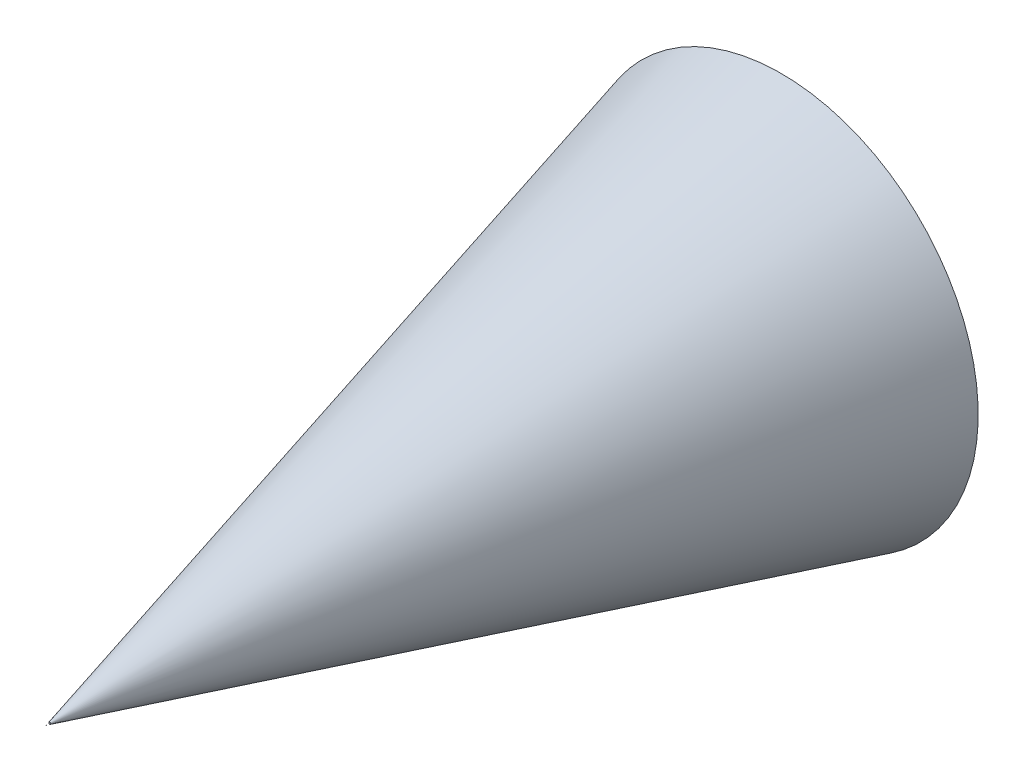
ISO-10303-21;
HEADER;
FILE_DESCRIPTION(('STEP AP214'),'2;1');
FILE_NAME('part.step','',(''),(''),'','','');
FILE_SCHEMA(('AUTOMOTIVE_DESIGN { 1 0 10303 214 1 1 1 1 }'));
ENDSEC;
DATA;
#1=APPLICATION_CONTEXT('core data for automotive mechanical design processes');
#2=APPLICATION_PROTOCOL_DEFINITION('international standard','automotive_design',2000,#1);
#3=PRODUCT_CONTEXT('',#1,'mechanical');
#4=PRODUCT('Part','Part','',(#3));
#5=PRODUCT_RELATED_PRODUCT_CATEGORY('part','',(#4));
#6=PRODUCT_DEFINITION_FORMATION('','',#4);
#7=PRODUCT_DEFINITION_CONTEXT('part definition',#1,'design');
#8=PRODUCT_DEFINITION('design','',#6,#7);
#9=PRODUCT_DEFINITION_SHAPE('','',#8);
#10=(LENGTH_UNIT() NAMED_UNIT(*) SI_UNIT(.MILLI.,.METRE.));
#11=(NAMED_UNIT(*) PLANE_ANGLE_UNIT() SI_UNIT($,.RADIAN.));
#12=(NAMED_UNIT(*) SI_UNIT($,.STERADIAN.) SOLID_ANGLE_UNIT());
#13=UNCERTAINTY_MEASURE_WITH_UNIT(LENGTH_MEASURE(1.E-05),#10,'distance_accuracy_value','');
#14=(GEOMETRIC_REPRESENTATION_CONTEXT(3) GLOBAL_UNCERTAINTY_ASSIGNED_CONTEXT((#13)) GLOBAL_UNIT_ASSIGNED_CONTEXT((#10,
#11,#12)) REPRESENTATION_CONTEXT('',''));
#15=CARTESIAN_POINT('',(0.,0.,0.));
#16=DIRECTION('',(0.,0.,1.));
#17=DIRECTION('',(1.,0.,0.));
#18=AXIS2_PLACEMENT_3D('',#15,#16,#17);
#19=CARTESIAN_POINT('',(0.5,0.500000000000002,-1.));
#20=DIRECTION('',(1.,0.,0.));
#21=DIRECTION('',(0.,0.,-1.));
#22=AXIS2_PLACEMENT_3D('',#19,#20,#21);
#23=PLANE('',#22);
#24=DIRECTION('',(0.,1.,0.));
#25=VECTOR('',#24,1.);
#26=CARTESIAN_POINT('',(0.5,0.500000000000002,0.));
#27=LINE('',#26,#25);
#28=CARTESIAN_POINT('',(0.5,-0.499999999999999,0.));
#29=VERTEX_POINT('',#28);
#30=CARTESIAN_POINT('',(0.5,0.500000000000002,0.));
#31=VERTEX_POINT('',#30);
#32=EDGE_CURVE('E105',#29,#31,#27,.T.);
#33=ORIENTED_EDGE('',*,*,#32,.F.);
#34=DIRECTION('',(0.,0.,1.));
#35=VECTOR('',#34,1.);
#36=CARTESIAN_POINT('',(0.5,-0.499999999999999,-1.));
#37=LINE('',#36,#35);
#38=CARTESIAN_POINT('',(0.5,-0.499999999999999,-1.));
#39=VERTEX_POINT('',#38);
#40=EDGE_CURVE('E12',#39,#29,#37,.T.);
#41=ORIENTED_EDGE('',*,*,#40,.F.);
#42=DIRECTION('',(0.,1.,0.));
#43=VECTOR('',#42,1.);
#44=CARTESIAN_POINT('',(0.5,0.500000000000002,-1.));
#45=LINE('',#44,#43);
#46=CARTESIAN_POINT('',(0.5,0.500000000000002,-1.));
#47=VERTEX_POINT('',#46);
#48=EDGE_CURVE('E99',#39,#47,#45,.T.);
#49=ORIENTED_EDGE('',*,*,#48,.T.);
#50=DIRECTION('',(0.,0.,1.));
#51=VECTOR('',#50,1.);
#52=CARTESIAN_POINT('',(0.5,0.500000000000002,-1.));
#53=LINE('',#52,#51);
#54=EDGE_CURVE('E44',#47,#31,#53,.T.);
#55=ORIENTED_EDGE('',*,*,#54,.T.);
#56=EDGE_LOOP('',(#33,#41,#49,#55));
#57=FACE_BOUND('',#56,.T.);
#58=ADVANCED_FACE('F41',(#57),#23,.T.);
#59=CARTESIAN_POINT('',(-0.5,-0.499999999999999,-1.));
#60=DIRECTION('',(0.,-1.,0.));
#61=DIRECTION('',(0.,0.,-1.));
#62=AXIS2_PLACEMENT_3D('',#59,#60,#61);
#63=PLANE('',#62);
#64=DIRECTION('',(1.,0.,0.));
#65=VECTOR('',#64,1.);
#66=CARTESIAN_POINT('',(-0.5,-0.499999999999999,0.));
#67=LINE('',#66,#65);
#68=CARTESIAN_POINT('',(-0.5,-0.499999999999999,0.));
#69=VERTEX_POINT('',#68);
#70=EDGE_CURVE('E101',#69,#29,#67,.T.);
#71=ORIENTED_EDGE('',*,*,#70,.F.);
#72=DIRECTION('',(0.,0.,1.));
#73=VECTOR('',#72,1.);
#74=CARTESIAN_POINT('',(-0.5,-0.499999999999999,-1.));
#75=LINE('',#74,#73);
#76=CARTESIAN_POINT('',(-0.5,-0.499999999999999,-1.));
#77=VERTEX_POINT('',#76);
#78=EDGE_CURVE('E50',#77,#69,#75,.T.);
#79=ORIENTED_EDGE('',*,*,#78,.F.);
#80=DIRECTION('',(1.,0.,0.));
#81=VECTOR('',#80,1.);
#82=CARTESIAN_POINT('',(-0.5,-0.499999999999999,-1.));
#83=LINE('',#82,#81);
#84=EDGE_CURVE('E96',#77,#39,#83,.T.);
#85=ORIENTED_EDGE('',*,*,#84,.T.);
#86=ORIENTED_EDGE('',*,*,#40,.T.);
#87=EDGE_LOOP('',(#71,#79,#85,#86));
#88=FACE_BOUND('',#87,.T.);
#89=ADVANCED_FACE('F115',(#88),#63,.T.);
#90=CARTESIAN_POINT('',(-0.5,0.500000000000002,-1.));
#91=DIRECTION('',(-1.,0.,0.));
#92=DIRECTION('',(0.,-1.,0.));
#93=AXIS2_PLACEMENT_3D('',#90,#91,#92);
#94=PLANE('',#93);
#95=DIRECTION('',(0.,-1.,0.));
#96=VECTOR('',#95,1.);
#97=CARTESIAN_POINT('',(-0.5,0.500000000000002,0.));
#98=LINE('',#97,#96);
#99=CARTESIAN_POINT('',(-0.5,0.500000000000002,0.));
#100=VERTEX_POINT('',#99);
#101=EDGE_CURVE('E91',#100,#69,#98,.T.);
#102=ORIENTED_EDGE('',*,*,#101,.F.);
#103=DIRECTION('',(0.,0.,1.));
#104=VECTOR('',#103,1.);
#105=CARTESIAN_POINT('',(-0.5,0.500000000000002,-1.));
#106=LINE('',#105,#104);
#107=CARTESIAN_POINT('',(-0.5,0.500000000000002,-1.));
#108=VERTEX_POINT('',#107);
#109=EDGE_CURVE('E86',#108,#100,#106,.T.);
#110=ORIENTED_EDGE('',*,*,#109,.F.);
#111=DIRECTION('',(0.,-1.,0.));
#112=VECTOR('',#111,1.);
#113=CARTESIAN_POINT('',(-0.5,0.500000000000002,-1.));
#114=LINE('',#113,#112);
#115=EDGE_CURVE('E89',#108,#77,#114,.T.);
#116=ORIENTED_EDGE('',*,*,#115,.T.);
#117=ORIENTED_EDGE('',*,*,#78,.T.);
#118=EDGE_LOOP('',(#102,#110,#116,#117));
#119=FACE_BOUND('',#118,.T.);
#120=ADVANCED_FACE('F88',(#119),#94,.T.);
#121=CARTESIAN_POINT('',(-0.5,0.500000000000002,-1.));
#122=DIRECTION('',(0.,1.,0.));
#123=DIRECTION('',(0.,0.,1.));
#124=AXIS2_PLACEMENT_3D('',#121,#122,#123);
#125=PLANE('',#124);
#126=DIRECTION('',(-1.,0.,0.));
#127=VECTOR('',#126,1.);
#128=CARTESIAN_POINT('',(-0.5,0.500000000000002,0.));
#129=LINE('',#128,#127);
#130=EDGE_CURVE('E108',#31,#100,#129,.T.);
#131=ORIENTED_EDGE('',*,*,#130,.F.);
#132=ORIENTED_EDGE('',*,*,#54,.F.);
#133=DIRECTION('',(-1.,0.,0.));
#134=VECTOR('',#133,1.);
#135=CARTESIAN_POINT('',(-0.5,0.500000000000002,-1.));
#136=LINE('',#135,#134);
#137=EDGE_CURVE('E95',#47,#108,#136,.T.);
#138=ORIENTED_EDGE('',*,*,#137,.T.);
#139=ORIENTED_EDGE('',*,*,#109,.T.);
#140=EDGE_LOOP('',(#131,#132,#138,#139));
#141=FACE_BOUND('',#140,.T.);
#142=ADVANCED_FACE('F98',(#141),#125,.T.);
#143=CARTESIAN_POINT('',(0.,0.,-1.));
#144=DIRECTION('',(0.,0.,1.));
#145=DIRECTION('',(1.,0.,0.));
#146=AXIS2_PLACEMENT_3D('',#143,#144,#145);
#147=PLANE('',#146);
#148=ORIENTED_EDGE('',*,*,#48,.F.);
#149=ORIENTED_EDGE('',*,*,#84,.F.);
#150=ORIENTED_EDGE('',*,*,#115,.F.);
#151=ORIENTED_EDGE('',*,*,#137,.F.);
#152=EDGE_LOOP('',(#148,#149,#150,#151));
#153=FACE_BOUND('',#152,.T.);
#154=ADVANCED_FACE('F94',(#153),#147,.F.);
#155=CARTESIAN_POINT('',(0.,0.,0.));
#156=DIRECTION('',(0.,0.,1.));
#157=DIRECTION('',(1.,0.,0.));
#158=AXIS2_PLACEMENT_3D('',#155,#156,#157);
#159=PLANE('',#158);
#160=ORIENTED_EDGE('',*,*,#32,.T.);
#161=ORIENTED_EDGE('',*,*,#130,.T.);
#162=ORIENTED_EDGE('',*,*,#101,.T.);
#163=ORIENTED_EDGE('',*,*,#70,.T.);
#164=EDGE_LOOP('',(#160,#161,#162,#163));
#165=FACE_BOUND('',#164,.T.);
#166=ADVANCED_FACE('F114',(#165),#159,.T.);
#167=CLOSED_SHELL('',(#58,#89,#120,#142,#154,#166));
#168=MANIFOLD_SOLID_BREP('B2',#167);
#169=CARTESIAN_POINT('',(0.,0.,0.));
#170=DIRECTION('',(0.,0.,-1.));
#171=DIRECTION('',(-1.,0.,0.));
#172=AXIS2_PLACEMENT_3D('',#169,#170,#171);
#173=CONICAL_SURFACE('',#172,0.,0.261799387799143);
#174=CARTESIAN_POINT('',(0.,0.,-20.));
#175=DIRECTION('',(0.,0.,-1.));
#176=DIRECTION('',(-1.,0.,0.));
#177=AXIS2_PLACEMENT_3D('',#174,#175,#176);
#178=CIRCLE('',#177,5.35898384862231);
#179=CARTESIAN_POINT('',(-5.35898384862231,0.,-20.));
#180=VERTEX_POINT('',#179);
#181=EDGE_CURVE('E40',#180,#180,#178,.F.);
#182=CARTESIAN_POINT('',(0.,0.,-4000.));
#183=DIRECTION('',(0.,0.,1.));
#184=DIRECTION('',(1.,0.,0.));
#185=AXIS2_PLACEMENT_3D('',#182,#183,#184);
#186=CIRCLE('',#185,1071.79676972446);
#187=CARTESIAN_POINT('',(-1071.79676972446,0.,-4000.));
#188=VERTEX_POINT('',#187);
#189=EDGE_CURVE('E171',#188,#188,#186,.T.);
#190=CARTESIAN_POINT('',(-5.35898384862231,0.,-20.));
#191=CARTESIAN_POINT('',(-16.467710784829,0.,-61.4583333333334));
#192=CARTESIAN_POINT('',(-27.5764377210356,0.,-102.916666666667));
#193=CARTESIAN_POINT('',(-49.793891593449,0.,-185.833333333333));
#194=CARTESIAN_POINT('',(-60.9026185296556,0.,-227.291666666667));
#195=CARTESIAN_POINT('',(-83.120072402069,0.,-310.208333333333));
#196=CARTESIAN_POINT('',(-94.2287993382756,0.,-351.666666666667));
#197=CARTESIAN_POINT('',(-116.446253210689,0.,-434.583333333333));
#198=CARTESIAN_POINT('',(-127.554980146896,0.,-476.041666666667));
#199=CARTESIAN_POINT('',(-149.772434019309,0.,-558.958333333333));
#200=CARTESIAN_POINT('',(-160.881160955516,0.,-600.416666666667));
#201=CARTESIAN_POINT('',(-183.098614827929,0.,-683.333333333333));
#202=CARTESIAN_POINT('',(-194.207341764136,0.,-724.791666666667));
#203=CARTESIAN_POINT('',(-216.424795636549,0.,-807.708333333333));
#204=CARTESIAN_POINT('',(-227.533522572756,0.,-849.166666666667));
#205=CARTESIAN_POINT('',(-249.750976445169,0.,-932.083333333333));
#206=CARTESIAN_POINT('',(-260.859703381376,0.,-973.541666666667));
#207=CARTESIAN_POINT('',(-283.077157253789,0.,-1056.45833333333));
#208=CARTESIAN_POINT('',(-294.185884189996,0.,-1097.91666666667));
#209=CARTESIAN_POINT('',(-316.403338062409,0.,-1180.83333333333));
#210=CARTESIAN_POINT('',(-327.512064998616,0.,-1222.29166666667));
#211=CARTESIAN_POINT('',(-349.729518871029,0.,-1305.20833333333));
#212=CARTESIAN_POINT('',(-360.838245807236,0.,-1346.66666666667));
#213=CARTESIAN_POINT('',(-383.055699679649,0.,-1429.58333333333));
#214=CARTESIAN_POINT('',(-394.164426615856,0.,-1471.04166666667));
#215=CARTESIAN_POINT('',(-416.381880488269,0.,-1553.95833333333));
#216=CARTESIAN_POINT('',(-427.490607424476,0.,-1595.41666666667));
#217=CARTESIAN_POINT('',(-449.708061296889,0.,-1678.33333333333));
#218=CARTESIAN_POINT('',(-460.816788233096,0.,-1719.79166666667));
#219=CARTESIAN_POINT('',(-483.034242105509,0.,-1802.70833333333));
#220=CARTESIAN_POINT('',(-494.142969041716,0.,-1844.16666666667));
#221=CARTESIAN_POINT('',(-516.360422914129,0.,-1927.08333333333));
#222=CARTESIAN_POINT('',(-527.469149850336,0.,-1968.54166666667));
#223=CARTESIAN_POINT('',(-549.686603722749,0.,-2051.45833333333));
#224=CARTESIAN_POINT('',(-560.795330658956,0.,-2092.91666666667));
#225=CARTESIAN_POINT('',(-583.012784531369,0.,-2175.83333333333));
#226=CARTESIAN_POINT('',(-594.121511467576,0.,-2217.29166666667));
#227=CARTESIAN_POINT('',(-616.338965339989,0.,-2300.20833333333));
#228=CARTESIAN_POINT('',(-627.447692276196,0.,-2341.66666666667));
#229=CARTESIAN_POINT('',(-649.665146148609,0.,-2424.58333333333));
#230=CARTESIAN_POINT('',(-660.773873084816,0.,-2466.04166666667));
#231=CARTESIAN_POINT('',(-682.991326957229,0.,-2548.95833333333));
#232=CARTESIAN_POINT('',(-694.100053893436,0.,-2590.41666666667));
#233=CARTESIAN_POINT('',(-716.317507765849,0.,-2673.33333333333));
#234=CARTESIAN_POINT('',(-727.426234702056,0.,-2714.79166666667));
#235=CARTESIAN_POINT('',(-749.643688574469,0.,-2797.70833333333));
#236=CARTESIAN_POINT('',(-760.752415510676,0.,-2839.16666666667));
#237=CARTESIAN_POINT('',(-782.969869383089,0.,-2922.08333333333));
#238=CARTESIAN_POINT('',(-794.078596319296,0.,-2963.54166666667));
#239=CARTESIAN_POINT('',(-816.296050191709,0.,-3046.45833333333));
#240=CARTESIAN_POINT('',(-827.404777127916,0.,-3087.91666666667));
#241=CARTESIAN_POINT('',(-849.622231000329,0.,-3170.83333333333));
#242=CARTESIAN_POINT('',(-860.730957936536,0.,-3212.29166666667));
#243=CARTESIAN_POINT('',(-882.948411808949,0.,-3295.20833333333));
#244=CARTESIAN_POINT('',(-894.057138745156,0.,-3336.66666666667));
#245=CARTESIAN_POINT('',(-916.274592617569,0.,-3419.58333333333));
#246=CARTESIAN_POINT('',(-927.383319553776,0.,-3461.04166666667));
#247=CARTESIAN_POINT('',(-949.600773426189,0.,-3543.95833333333));
#248=CARTESIAN_POINT('',(-960.709500362396,0.,-3585.41666666667));
#249=CARTESIAN_POINT('',(-982.926954234809,0.,-3668.33333333333));
#250=CARTESIAN_POINT('',(-994.035681171016,0.,-3709.79166666667));
#251=CARTESIAN_POINT('',(-1016.25313504343,0.,-3792.70833333333));
#252=CARTESIAN_POINT('',(-1027.36186197964,0.,-3834.16666666667));
#253=CARTESIAN_POINT('',(-1049.57931585205,0.,-3917.08333333333));
#254=CARTESIAN_POINT('',(-1060.68804278826,0.,-3958.54166666667));
#255=CARTESIAN_POINT('',(-1071.79676972446,0.,-4000.));
#256=B_SPLINE_CURVE_WITH_KNOTS('',3,(#190,#191,#192,#193,#194,#195,#196,#197,#198,#199,#200,
#201,#202,#203,#204,#205,#206,#207,#208,#209,#210,#211,#212,#213,#214,#215,#216,#217,#218,#219,
#220,#221,#222,#223,#224,#225,#226,#227,#228,#229,#230,#231,#232,#233,#234,#235,#236,#237,#238,
#239,#240,#241,#242,#243,#244,#245,#246,#247,#248,#249,#250,#251,#252,#253,#254,#255),
.UNSPECIFIED.,.F.,.F.,(4,2,2,2,2,2,2,2,2,2,2,2,2,2,2,2,2,2,2,2,2,2,2,2,2,2,2,2,2,2,2,2,4),(0.,
128.762474938504,257.524949877008,386.287424815511,515.049899754015,643.812374692519,
772.574849631023,901.337324569527,1030.09979950803,1158.86227444653,1287.62474938504,
1416.38722432354,1545.14969926205,1673.91217420055,1802.67464913905,1931.43712407756,
2060.19959901606,2188.96207395457,2317.72454889307,2446.48702383157,2575.24949877008,
2704.01197370858,2832.77444864709,2961.53692358559,3090.29939852409,3219.0618734626,
3347.8243484011,3476.5868233396,3605.34929827811,3734.11177321661,3862.87424815512,
3991.63672309362,4120.39919803213),.UNSPECIFIED.);
#257=EDGE_CURVE('BSEAM165',#180,#188,#256,.T.);
#258=ORIENTED_EDGE('',*,*,#181,.F.);
#259=ORIENTED_EDGE('',*,*,#189,.T.);
#260=ORIENTED_EDGE('',*,*,#257,.T.);
#261=ORIENTED_EDGE('',*,*,#257,.F.);
#262=EDGE_LOOP('',(#258,#260,#259,#261));
#263=FACE_BOUND('',#262,.T.);
#264=ADVANCED_FACE('F165',(#263),#173,.T.);
#265=CARTESIAN_POINT('',(0.,0.,-4000.));
#266=DIRECTION('',(0.,0.,-1.));
#267=DIRECTION('',(-1.,0.,0.));
#268=AXIS2_PLACEMENT_3D('',#265,#266,#267);
#269=PLANE('',#268);
#270=ORIENTED_EDGE('',*,*,#189,.F.);
#271=EDGE_LOOP('',(#270));
#272=FACE_BOUND('',#271,.T.);
#273=ADVANCED_FACE('F178',(#272),#269,.T.);
#274=CARTESIAN_POINT('',(-1071.79676972446,-5.35898384862231,-20.));
#275=DIRECTION('',(0.,0.,-1.));
#276=DIRECTION('',(-1.,0.,0.));
#277=AXIS2_PLACEMENT_3D('',#274,#275,#276);
#278=PLANE('',#277);
#279=ORIENTED_EDGE('',*,*,#181,.T.);
#280=EDGE_LOOP('',(#279));
#281=FACE_BOUND('',#280,.T.);
#282=ADVANCED_FACE('F180',(#281),#278,.F.);
#283=CLOSED_SHELL('',(#264,#273,#282));
#284=MANIFOLD_SOLID_BREP('B6',#283);
#285=ADVANCED_BREP_SHAPE_REPRESENTATION('',(#18,#168,#284),#14);
#286=SHAPE_DEFINITION_REPRESENTATION(#9,#285);
ENDSEC;
END-ISO-10303-21;
